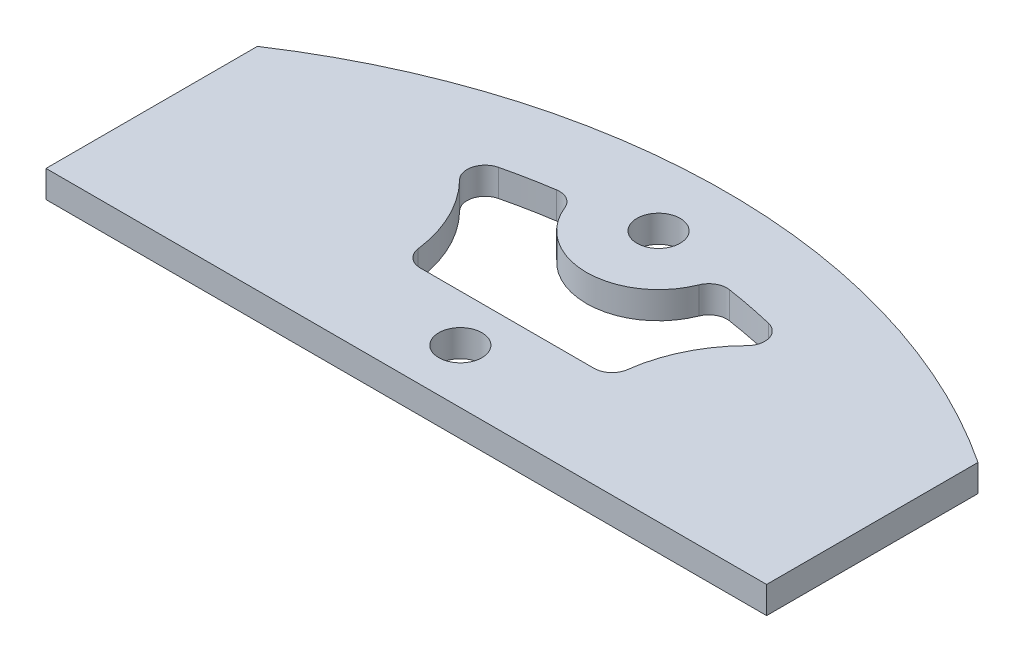
ISO-10303-21;
HEADER;
FILE_DESCRIPTION(('STEP AP214'),'2;1');
FILE_NAME('part.step','',(''),(''),'','','');
FILE_SCHEMA(('AUTOMOTIVE_DESIGN { 1 0 10303 214 1 1 1 1 }'));
ENDSEC;
DATA;
#1=APPLICATION_CONTEXT('core data for automotive mechanical design processes');
#2=APPLICATION_PROTOCOL_DEFINITION('international standard','automotive_design',2000,#1);
#3=PRODUCT_CONTEXT('',#1,'mechanical');
#4=PRODUCT('Part','Part','',(#3));
#5=PRODUCT_RELATED_PRODUCT_CATEGORY('part','',(#4));
#6=PRODUCT_DEFINITION_FORMATION('','',#4);
#7=PRODUCT_DEFINITION_CONTEXT('part definition',#1,'design');
#8=PRODUCT_DEFINITION('design','',#6,#7);
#9=PRODUCT_DEFINITION_SHAPE('','',#8);
#10=(LENGTH_UNIT() NAMED_UNIT(*) SI_UNIT(.MILLI.,.METRE.));
#11=(NAMED_UNIT(*) PLANE_ANGLE_UNIT() SI_UNIT($,.RADIAN.));
#12=(NAMED_UNIT(*) SI_UNIT($,.STERADIAN.) SOLID_ANGLE_UNIT());
#13=UNCERTAINTY_MEASURE_WITH_UNIT(LENGTH_MEASURE(1.E-05),#10,'distance_accuracy_value','');
#14=(GEOMETRIC_REPRESENTATION_CONTEXT(3) GLOBAL_UNCERTAINTY_ASSIGNED_CONTEXT((#13)) GLOBAL_UNIT_ASSIGNED_CONTEXT((#10,
#11,#12)) REPRESENTATION_CONTEXT('',''));
#15=CARTESIAN_POINT('',(0.,0.,0.));
#16=DIRECTION('',(0.,0.,1.));
#17=DIRECTION('',(1.,0.,0.));
#18=AXIS2_PLACEMENT_3D('',#15,#16,#17);
#19=CARTESIAN_POINT('',(17.0115720529893,3.,71.6490808823529));
#20=DIRECTION('',(0.,-1.,0.));
#21=DIRECTION('',(0.,0.,-1.));
#22=AXIS2_PLACEMENT_3D('',#19,#20,#21);
#23=PLANE('',#22);
#24=CARTESIAN_POINT('',(0.,3.,-43.));
#25=DIRECTION('',(0.,1.,0.));
#26=DIRECTION('',(0.,0.,1.));
#27=AXIS2_PLACEMENT_3D('',#24,#25,#26);
#28=CIRCLE('',#27,2.4);
#29=CARTESIAN_POINT('',(0.,3.,-40.6));
#30=VERTEX_POINT('',#29);
#31=EDGE_CURVE('E351',#30,#30,#28,.T.);
#32=ORIENTED_EDGE('',*,*,#31,.F.);
#33=EDGE_LOOP('',(#32));
#34=FACE_BOUND('',#33,.T.);
#35=CARTESIAN_POINT('',(0.,3.,-65.));
#36=DIRECTION('',(0.,1.,0.));
#37=DIRECTION('',(0.,0.,1.));
#38=AXIS2_PLACEMENT_3D('',#35,#36,#37);
#39=CIRCLE('',#38,2.4);
#40=CARTESIAN_POINT('',(0.,3.,-62.6));
#41=VERTEX_POINT('',#40);
#42=EDGE_CURVE('E353',#41,#41,#39,.T.);
#43=ORIENTED_EDGE('',*,*,#42,.F.);
#44=EDGE_LOOP('',(#43));
#45=FACE_BOUND('',#44,.T.);
#46=CARTESIAN_POINT('',(-14.5263223201297,3.,-60.2742561949271));
#47=DIRECTION('',(0.,1.,0.));
#48=DIRECTION('',(0.,0.,1.));
#49=AXIS2_PLACEMENT_3D('',#46,#47,#48);
#50=CIRCLE('',#49,2.);
#51=CARTESIAN_POINT('',(-15.9518854835434,3.,-58.871484058364));
#52=VERTEX_POINT('',#51);
#53=CARTESIAN_POINT('',(-14.9949133627145,3.,-62.2185870399247));
#54=VERTEX_POINT('',#53);
#55=EDGE_CURVE('E57',#52,#54,#50,.F.);
#56=ORIENTED_EDGE('',*,*,#55,.T.);
#57=CARTESIAN_POINT('',(0.,3.,0.));
#58=DIRECTION('',(0.,1.,0.));
#59=DIRECTION('',(0.,0.,1.));
#60=AXIS2_PLACEMENT_3D('',#57,#58,#59);
#61=CIRCLE('',#60,64.);
#62=CARTESIAN_POINT('',(-9.5900052029121,3.,-63.2774193548387));
#63=VERTEX_POINT('',#62);
#64=EDGE_CURVE('E179',#63,#54,#61,.T.);
#65=ORIENTED_EDGE('',*,*,#64,.F.);
#66=CARTESIAN_POINT('',(-9.2903175403211,3.,-61.3));
#67=DIRECTION('',(0.,1.,0.));
#68=DIRECTION('',(0.,0.,1.));
#69=AXIS2_PLACEMENT_3D('',#66,#67,#68);
#70=CIRCLE('',#69,2.);
#71=CARTESIAN_POINT('',(-7.43225403225686,3.,-62.04));
#72=VERTEX_POINT('',#71);
#73=EDGE_CURVE('E235',#63,#72,#70,.F.);
#74=ORIENTED_EDGE('',*,*,#73,.T.);
#75=CARTESIAN_POINT('',(0.,3.,-65.));
#76=DIRECTION('',(0.,1.,0.));
#77=DIRECTION('',(0.,0.,1.));
#78=AXIS2_PLACEMENT_3D('',#75,#76,#77);
#79=CIRCLE('',#78,7.99999999999991);
#80=CARTESIAN_POINT('',(7.43225403225689,3.,-62.04));
#81=VERTEX_POINT('',#80);
#82=EDGE_CURVE('E232',#72,#81,#79,.T.);
#83=ORIENTED_EDGE('',*,*,#82,.T.);
#84=CARTESIAN_POINT('',(9.29031754032113,3.,-61.3));
#85=DIRECTION('',(0.,1.,0.));
#86=DIRECTION('',(0.,0.,1.));
#87=AXIS2_PLACEMENT_3D('',#84,#85,#86);
#88=CIRCLE('',#87,2.);
#89=CARTESIAN_POINT('',(9.59000520291214,3.,-63.2774193548387));
#90=VERTEX_POINT('',#89);
#91=EDGE_CURVE('E229',#81,#90,#88,.F.);
#92=ORIENTED_EDGE('',*,*,#91,.T.);
#93=CARTESIAN_POINT('',(0.,3.,0.));
#94=DIRECTION('',(0.,1.,0.));
#95=DIRECTION('',(0.,0.,1.));
#96=AXIS2_PLACEMENT_3D('',#93,#94,#95);
#97=CIRCLE('',#96,64.);
#98=CARTESIAN_POINT('',(14.9949133627145,3.,-62.2185870399247));
#99=VERTEX_POINT('',#98);
#100=EDGE_CURVE('E226',#99,#90,#97,.T.);
#101=ORIENTED_EDGE('',*,*,#100,.F.);
#102=CARTESIAN_POINT('',(14.5263223201297,3.,-60.274256194927));
#103=DIRECTION('',(0.,1.,0.));
#104=DIRECTION('',(0.,0.,1.));
#105=AXIS2_PLACEMENT_3D('',#102,#103,#104);
#106=CIRCLE('',#105,2.);
#107=CARTESIAN_POINT('',(15.9518854835434,3.,-58.871484058364));
#108=VERTEX_POINT('',#107);
#109=EDGE_CURVE('E223',#99,#108,#106,.F.);
#110=ORIENTED_EDGE('',*,*,#109,.T.);
#111=CARTESIAN_POINT('',(27.,3.,-48.));
#112=DIRECTION('',(0.,1.,0.));
#113=DIRECTION('',(0.,0.,1.));
#114=AXIS2_PLACEMENT_3D('',#111,#112,#113);
#115=CIRCLE('',#114,15.5);
#116=CARTESIAN_POINT('',(11.6229694222924,3.,-49.9485714285714));
#117=VERTEX_POINT('',#116);
#118=EDGE_CURVE('E220',#108,#117,#115,.T.);
#119=ORIENTED_EDGE('',*,*,#118,.T.);
#120=CARTESIAN_POINT('',(9.63883644452367,3.,-50.2));
#121=DIRECTION('',(0.,1.,0.));
#122=DIRECTION('',(0.,0.,1.));
#123=AXIS2_PLACEMENT_3D('',#120,#121,#122);
#124=CIRCLE('',#123,2.);
#125=CARTESIAN_POINT('',(9.63883644452367,3.,-48.2));
#126=VERTEX_POINT('',#125);
#127=EDGE_CURVE('E217',#126,#117,#124,.T.);
#128=ORIENTED_EDGE('',*,*,#127,.F.);
#129=DIRECTION('',(1.,0.,0.));
#130=VECTOR('',#129,1.);
#131=CARTESIAN_POINT('',(0.,3.,-48.2));
#132=LINE('',#131,#130);
#133=CARTESIAN_POINT('',(-9.63883644452365,3.,-48.2));
#134=VERTEX_POINT('',#133);
#135=EDGE_CURVE('E214',#134,#126,#132,.T.);
#136=ORIENTED_EDGE('',*,*,#135,.F.);
#137=CARTESIAN_POINT('',(-9.63883644452365,3.,-50.2));
#138=DIRECTION('',(0.,1.,0.));
#139=DIRECTION('',(0.,0.,1.));
#140=AXIS2_PLACEMENT_3D('',#137,#138,#139);
#141=CIRCLE('',#140,2.);
#142=CARTESIAN_POINT('',(-11.6229694222924,3.,-49.9485714285714));
#143=VERTEX_POINT('',#142);
#144=EDGE_CURVE('E211',#134,#143,#141,.F.);
#145=ORIENTED_EDGE('',*,*,#144,.T.);
#146=CARTESIAN_POINT('',(-27.,3.,-48.));
#147=DIRECTION('',(0.,1.,0.));
#148=DIRECTION('',(0.,0.,1.));
#149=AXIS2_PLACEMENT_3D('',#146,#147,#148);
#150=CIRCLE('',#149,15.5);
#151=EDGE_CURVE('E208',#143,#52,#150,.T.);
#152=ORIENTED_EDGE('',*,*,#151,.T.);
#153=EDGE_LOOP('',(#56,#65,#74,#83,#92,#101,#110,#119,#128,#136,#145,#152));
#154=FACE_BOUND('',#153,.T.);
#155=DIRECTION('',(0.,0.,-1.));
#156=VECTOR('',#155,1.);
#157=CARTESIAN_POINT('',(40.,3.,-77.0000000000001));
#158=LINE('',#157,#156);
#159=CARTESIAN_POINT('',(40.,3.,-37.0000000000001));
#160=VERTEX_POINT('',#159);
#161=CARTESIAN_POINT('',(40.,3.,-60.4669331122391));
#162=VERTEX_POINT('',#161);
#163=EDGE_CURVE('E169',#160,#162,#158,.T.);
#164=ORIENTED_EDGE('',*,*,#163,.T.);
#165=CARTESIAN_POINT('',(0.,3.,0.));
#166=DIRECTION('',(0.,1.,0.));
#167=DIRECTION('',(0.,0.,1.));
#168=AXIS2_PLACEMENT_3D('',#165,#166,#167);
#169=CIRCLE('',#168,72.5);
#170=CARTESIAN_POINT('',(-40.,3.,-60.4669331122391));
#171=VERTEX_POINT('',#170);
#172=EDGE_CURVE('E264',#162,#171,#169,.T.);
#173=ORIENTED_EDGE('',*,*,#172,.T.);
#174=DIRECTION('',(0.,0.,1.));
#175=VECTOR('',#174,1.);
#176=CARTESIAN_POINT('',(-40.,3.,-77.0000000000001));
#177=LINE('',#176,#175);
#178=CARTESIAN_POINT('',(-40.,3.,-37.0000000000001));
#179=VERTEX_POINT('',#178);
#180=EDGE_CURVE('E49',#171,#179,#177,.T.);
#181=ORIENTED_EDGE('',*,*,#180,.T.);
#182=DIRECTION('',(1.,0.,0.));
#183=VECTOR('',#182,1.);
#184=CARTESIAN_POINT('',(-40.,3.,-37.0000000000001));
#185=LINE('',#184,#183);
#186=EDGE_CURVE('E162',#179,#160,#185,.T.);
#187=ORIENTED_EDGE('',*,*,#186,.T.);
#188=EDGE_LOOP('',(#164,#173,#181,#187));
#189=FACE_BOUND('',#188,.T.);
#190=ADVANCED_FACE('F34',(#34,#45,#154,#189),#23,.F.);
#191=CARTESIAN_POINT('',(17.0115720529893,0.,71.6490808823529));
#192=DIRECTION('',(0.,-1.,0.));
#193=DIRECTION('',(0.,0.,-1.));
#194=AXIS2_PLACEMENT_3D('',#191,#192,#193);
#195=PLANE('',#194);
#196=CARTESIAN_POINT('',(0.,0.,-43.));
#197=DIRECTION('',(0.,1.,0.));
#198=DIRECTION('',(0.,0.,1.));
#199=AXIS2_PLACEMENT_3D('',#196,#197,#198);
#200=CIRCLE('',#199,2.4);
#201=CARTESIAN_POINT('',(0.,0.,-40.6));
#202=VERTEX_POINT('',#201);
#203=EDGE_CURVE('E349',#202,#202,#200,.T.);
#204=ORIENTED_EDGE('',*,*,#203,.T.);
#205=EDGE_LOOP('',(#204));
#206=FACE_BOUND('',#205,.T.);
#207=CARTESIAN_POINT('',(0.,0.,-65.));
#208=DIRECTION('',(0.,1.,0.));
#209=DIRECTION('',(0.,0.,1.));
#210=AXIS2_PLACEMENT_3D('',#207,#208,#209);
#211=CIRCLE('',#210,2.4);
#212=CARTESIAN_POINT('',(0.,0.,-62.6));
#213=VERTEX_POINT('',#212);
#214=EDGE_CURVE('E172',#213,#213,#211,.T.);
#215=ORIENTED_EDGE('',*,*,#214,.T.);
#216=EDGE_LOOP('',(#215));
#217=FACE_BOUND('',#216,.T.);
#218=CARTESIAN_POINT('',(0.,0.,0.));
#219=DIRECTION('',(0.,1.,0.));
#220=DIRECTION('',(0.,0.,1.));
#221=AXIS2_PLACEMENT_3D('',#218,#219,#220);
#222=CIRCLE('',#221,64.);
#223=CARTESIAN_POINT('',(-9.5900052029121,0.,-63.2774193548387));
#224=VERTEX_POINT('',#223);
#225=CARTESIAN_POINT('',(-14.9949133627145,0.,-62.2185870399247));
#226=VERTEX_POINT('',#225);
#227=EDGE_CURVE('E203',#224,#226,#222,.T.);
#228=ORIENTED_EDGE('',*,*,#227,.T.);
#229=CARTESIAN_POINT('',(-14.5263223201297,0.,-60.2742561949271));
#230=DIRECTION('',(0.,1.,0.));
#231=DIRECTION('',(0.,0.,1.));
#232=AXIS2_PLACEMENT_3D('',#229,#230,#231);
#233=CIRCLE('',#232,2.);
#234=CARTESIAN_POINT('',(-15.9518854835434,0.,-58.871484058364));
#235=VERTEX_POINT('',#234);
#236=EDGE_CURVE('E176',#235,#226,#233,.F.);
#237=ORIENTED_EDGE('',*,*,#236,.F.);
#238=CARTESIAN_POINT('',(-27.,0.,-48.));
#239=DIRECTION('',(0.,1.,0.));
#240=DIRECTION('',(0.,0.,1.));
#241=AXIS2_PLACEMENT_3D('',#238,#239,#240);
#242=CIRCLE('',#241,15.5);
#243=CARTESIAN_POINT('',(-11.6229694222924,0.,-49.9485714285714));
#244=VERTEX_POINT('',#243);
#245=EDGE_CURVE('E178',#244,#235,#242,.T.);
#246=ORIENTED_EDGE('',*,*,#245,.F.);
#247=CARTESIAN_POINT('',(-9.63883644452365,0.,-50.2));
#248=DIRECTION('',(0.,1.,0.));
#249=DIRECTION('',(0.,0.,1.));
#250=AXIS2_PLACEMENT_3D('',#247,#248,#249);
#251=CIRCLE('',#250,2.);
#252=CARTESIAN_POINT('',(-9.63883644452365,0.,-48.2));
#253=VERTEX_POINT('',#252);
#254=EDGE_CURVE('E181',#253,#244,#251,.F.);
#255=ORIENTED_EDGE('',*,*,#254,.F.);
#256=DIRECTION('',(1.,0.,0.));
#257=VECTOR('',#256,1.);
#258=CARTESIAN_POINT('',(0.,0.,-48.2));
#259=LINE('',#258,#257);
#260=CARTESIAN_POINT('',(9.63883644452367,0.,-48.2));
#261=VERTEX_POINT('',#260);
#262=EDGE_CURVE('E184',#253,#261,#259,.T.);
#263=ORIENTED_EDGE('',*,*,#262,.T.);
#264=CARTESIAN_POINT('',(9.63883644452367,0.,-50.2));
#265=DIRECTION('',(0.,1.,0.));
#266=DIRECTION('',(0.,0.,1.));
#267=AXIS2_PLACEMENT_3D('',#264,#265,#266);
#268=CIRCLE('',#267,2.);
#269=CARTESIAN_POINT('',(11.6229694222924,0.,-49.9485714285714));
#270=VERTEX_POINT('',#269);
#271=EDGE_CURVE('E187',#261,#270,#268,.T.);
#272=ORIENTED_EDGE('',*,*,#271,.T.);
#273=CARTESIAN_POINT('',(27.,0.,-48.));
#274=DIRECTION('',(0.,1.,0.));
#275=DIRECTION('',(0.,0.,1.));
#276=AXIS2_PLACEMENT_3D('',#273,#274,#275);
#277=CIRCLE('',#276,15.5);
#278=CARTESIAN_POINT('',(15.9518854835434,0.,-58.871484058364));
#279=VERTEX_POINT('',#278);
#280=EDGE_CURVE('E190',#279,#270,#277,.T.);
#281=ORIENTED_EDGE('',*,*,#280,.F.);
#282=CARTESIAN_POINT('',(14.5263223201297,0.,-60.274256194927));
#283=DIRECTION('',(0.,1.,0.));
#284=DIRECTION('',(0.,0.,1.));
#285=AXIS2_PLACEMENT_3D('',#282,#283,#284);
#286=CIRCLE('',#285,2.);
#287=CARTESIAN_POINT('',(14.9949133627145,0.,-62.2185870399247));
#288=VERTEX_POINT('',#287);
#289=EDGE_CURVE('E192',#288,#279,#286,.F.);
#290=ORIENTED_EDGE('',*,*,#289,.F.);
#291=CARTESIAN_POINT('',(0.,0.,0.));
#292=DIRECTION('',(0.,1.,0.));
#293=DIRECTION('',(0.,0.,1.));
#294=AXIS2_PLACEMENT_3D('',#291,#292,#293);
#295=CIRCLE('',#294,64.);
#296=CARTESIAN_POINT('',(9.59000520291214,0.,-63.2774193548387));
#297=VERTEX_POINT('',#296);
#298=EDGE_CURVE('E194',#288,#297,#295,.T.);
#299=ORIENTED_EDGE('',*,*,#298,.T.);
#300=CARTESIAN_POINT('',(9.29031754032113,0.,-61.3));
#301=DIRECTION('',(0.,1.,0.));
#302=DIRECTION('',(0.,0.,1.));
#303=AXIS2_PLACEMENT_3D('',#300,#301,#302);
#304=CIRCLE('',#303,2.);
#305=CARTESIAN_POINT('',(7.43225403225689,0.,-62.04));
#306=VERTEX_POINT('',#305);
#307=EDGE_CURVE('E197',#306,#297,#304,.F.);
#308=ORIENTED_EDGE('',*,*,#307,.F.);
#309=CARTESIAN_POINT('',(0.,0.,-65.));
#310=DIRECTION('',(0.,1.,0.));
#311=DIRECTION('',(0.,0.,1.));
#312=AXIS2_PLACEMENT_3D('',#309,#310,#311);
#313=CIRCLE('',#312,7.99999999999991);
#314=CARTESIAN_POINT('',(-7.43225403225686,0.,-62.04));
#315=VERTEX_POINT('',#314);
#316=EDGE_CURVE('E199',#315,#306,#313,.T.);
#317=ORIENTED_EDGE('',*,*,#316,.F.);
#318=CARTESIAN_POINT('',(-9.2903175403211,0.,-61.3));
#319=DIRECTION('',(0.,1.,0.));
#320=DIRECTION('',(0.,0.,1.));
#321=AXIS2_PLACEMENT_3D('',#318,#319,#320);
#322=CIRCLE('',#321,2.);
#323=EDGE_CURVE('E201',#224,#315,#322,.F.);
#324=ORIENTED_EDGE('',*,*,#323,.F.);
#325=EDGE_LOOP('',(#228,#237,#246,#255,#263,#272,#281,#290,#299,#308,#317,#324));
#326=FACE_BOUND('',#325,.T.);
#327=CARTESIAN_POINT('',(0.,0.,0.));
#328=DIRECTION('',(0.,1.,0.));
#329=DIRECTION('',(0.,0.,1.));
#330=AXIS2_PLACEMENT_3D('',#327,#328,#329);
#331=CIRCLE('',#330,72.5);
#332=CARTESIAN_POINT('',(40.,0.,-60.4669331122391));
#333=VERTEX_POINT('',#332);
#334=CARTESIAN_POINT('',(-40.,0.,-60.4669331122391));
#335=VERTEX_POINT('',#334);
#336=EDGE_CURVE('E242',#333,#335,#331,.T.);
#337=ORIENTED_EDGE('',*,*,#336,.F.);
#338=DIRECTION('',(0.,0.,-1.));
#339=VECTOR('',#338,1.);
#340=CARTESIAN_POINT('',(40.,0.,-77.0000000000001));
#341=LINE('',#340,#339);
#342=CARTESIAN_POINT('',(40.,0.,-37.0000000000001));
#343=VERTEX_POINT('',#342);
#344=EDGE_CURVE('E155',#343,#333,#341,.T.);
#345=ORIENTED_EDGE('',*,*,#344,.F.);
#346=DIRECTION('',(1.,0.,0.));
#347=VECTOR('',#346,1.);
#348=CARTESIAN_POINT('',(-40.,0.,-37.0000000000001));
#349=LINE('',#348,#347);
#350=CARTESIAN_POINT('',(-40.,0.,-37.0000000000001));
#351=VERTEX_POINT('',#350);
#352=EDGE_CURVE('E154',#351,#343,#349,.T.);
#353=ORIENTED_EDGE('',*,*,#352,.F.);
#354=DIRECTION('',(0.,0.,1.));
#355=VECTOR('',#354,1.);
#356=CARTESIAN_POINT('',(-40.,0.,-77.0000000000001));
#357=LINE('',#356,#355);
#358=EDGE_CURVE('E145',#335,#351,#357,.T.);
#359=ORIENTED_EDGE('',*,*,#358,.F.);
#360=EDGE_LOOP('',(#337,#345,#353,#359));
#361=FACE_BOUND('',#360,.T.);
#362=ADVANCED_FACE('F165',(#206,#217,#326,#361),#195,.T.);
#363=CARTESIAN_POINT('',(0.,3.,0.));
#364=DIRECTION('',(0.,-1.,0.));
#365=DIRECTION('',(0.,0.,-1.));
#366=AXIS2_PLACEMENT_3D('',#363,#364,#365);
#367=CYLINDRICAL_SURFACE('',#366,72.5);
#368=DIRECTION('',(0.,-1.,0.));
#369=VECTOR('',#368,1.);
#370=CARTESIAN_POINT('',(40.,3.,-60.4669331122391));
#371=LINE('',#370,#369);
#372=EDGE_CURVE('E12',#333,#162,#371,.F.);
#373=ORIENTED_EDGE('',*,*,#372,.F.);
#374=ORIENTED_EDGE('',*,*,#336,.T.);
#375=DIRECTION('',(0.,-1.,0.));
#376=VECTOR('',#375,1.);
#377=CARTESIAN_POINT('',(-40.,3.,-60.4669331122391));
#378=LINE('',#377,#376);
#379=EDGE_CURVE('E42',#171,#335,#378,.T.);
#380=ORIENTED_EDGE('',*,*,#379,.F.);
#381=ORIENTED_EDGE('',*,*,#172,.F.);
#382=EDGE_LOOP('',(#373,#374,#380,#381));
#383=FACE_BOUND('',#382,.T.);
#384=ADVANCED_FACE('F36',(#383),#367,.T.);
#385=CARTESIAN_POINT('',(-14.5263223201297,0.,-60.2742561949271));
#386=DIRECTION('',(0.,1.,0.));
#387=DIRECTION('',(0.,0.,1.));
#388=AXIS2_PLACEMENT_3D('',#385,#386,#387);
#389=CYLINDRICAL_SURFACE('',#388,2.);
#390=ORIENTED_EDGE('',*,*,#55,.F.);
#391=DIRECTION('',(0.,1.,0.));
#392=VECTOR('',#391,1.);
#393=CARTESIAN_POINT('',(-15.9518854835434,0.,-58.871484058364));
#394=LINE('',#393,#392);
#395=EDGE_CURVE('E206',#235,#52,#394,.T.);
#396=ORIENTED_EDGE('',*,*,#395,.F.);
#397=ORIENTED_EDGE('',*,*,#236,.T.);
#398=DIRECTION('',(0.,1.,0.));
#399=VECTOR('',#398,1.);
#400=CARTESIAN_POINT('',(-14.9949133627145,0.,-62.2185870399247));
#401=LINE('',#400,#399);
#402=EDGE_CURVE('E240',#226,#54,#401,.T.);
#403=ORIENTED_EDGE('',*,*,#402,.T.);
#404=EDGE_LOOP('',(#390,#396,#397,#403));
#405=FACE_BOUND('',#404,.T.);
#406=ADVANCED_FACE('F284',(#405),#389,.F.);
#407=CARTESIAN_POINT('',(0.,0.,0.));
#408=DIRECTION('',(0.,1.,0.));
#409=DIRECTION('',(0.,0.,1.));
#410=AXIS2_PLACEMENT_3D('',#407,#408,#409);
#411=CYLINDRICAL_SURFACE('',#410,64.);
#412=ORIENTED_EDGE('',*,*,#64,.T.);
#413=ORIENTED_EDGE('',*,*,#402,.F.);
#414=ORIENTED_EDGE('',*,*,#227,.F.);
#415=DIRECTION('',(0.,1.,0.));
#416=VECTOR('',#415,1.);
#417=CARTESIAN_POINT('',(-9.5900052029121,0.,-63.2774193548387));
#418=LINE('',#417,#416);
#419=EDGE_CURVE('E243',#224,#63,#418,.T.);
#420=ORIENTED_EDGE('',*,*,#419,.T.);
#421=EDGE_LOOP('',(#412,#413,#414,#420));
#422=FACE_BOUND('',#421,.T.);
#423=ADVANCED_FACE('F287',(#422),#411,.F.);
#424=CARTESIAN_POINT('',(-9.2903175403211,0.,-61.3));
#425=DIRECTION('',(0.,1.,0.));
#426=DIRECTION('',(0.,0.,1.));
#427=AXIS2_PLACEMENT_3D('',#424,#425,#426);
#428=CYLINDRICAL_SURFACE('',#427,2.);
#429=ORIENTED_EDGE('',*,*,#73,.F.);
#430=ORIENTED_EDGE('',*,*,#419,.F.);
#431=ORIENTED_EDGE('',*,*,#323,.T.);
#432=DIRECTION('',(0.,1.,0.));
#433=VECTOR('',#432,1.);
#434=CARTESIAN_POINT('',(-7.43225403225686,0.,-62.04));
#435=LINE('',#434,#433);
#436=EDGE_CURVE('E245',#315,#72,#435,.T.);
#437=ORIENTED_EDGE('',*,*,#436,.T.);
#438=EDGE_LOOP('',(#429,#430,#431,#437));
#439=FACE_BOUND('',#438,.T.);
#440=ADVANCED_FACE('F323',(#439),#428,.F.);
#441=CARTESIAN_POINT('',(0.,0.,-65.));
#442=DIRECTION('',(0.,1.,0.));
#443=DIRECTION('',(0.,0.,1.));
#444=AXIS2_PLACEMENT_3D('',#441,#442,#443);
#445=CYLINDRICAL_SURFACE('',#444,7.99999999999991);
#446=ORIENTED_EDGE('',*,*,#82,.F.);
#447=ORIENTED_EDGE('',*,*,#436,.F.);
#448=ORIENTED_EDGE('',*,*,#316,.T.);
#449=DIRECTION('',(0.,1.,0.));
#450=VECTOR('',#449,1.);
#451=CARTESIAN_POINT('',(7.43225403225689,0.,-62.04));
#452=LINE('',#451,#450);
#453=EDGE_CURVE('E247',#306,#81,#452,.T.);
#454=ORIENTED_EDGE('',*,*,#453,.T.);
#455=EDGE_LOOP('',(#446,#447,#448,#454));
#456=FACE_BOUND('',#455,.T.);
#457=ADVANCED_FACE('F319',(#456),#445,.T.);
#458=CARTESIAN_POINT('',(9.29031754032113,0.,-61.3));
#459=DIRECTION('',(0.,1.,0.));
#460=DIRECTION('',(0.,0.,1.));
#461=AXIS2_PLACEMENT_3D('',#458,#459,#460);
#462=CYLINDRICAL_SURFACE('',#461,2.);
#463=ORIENTED_EDGE('',*,*,#91,.F.);
#464=ORIENTED_EDGE('',*,*,#453,.F.);
#465=ORIENTED_EDGE('',*,*,#307,.T.);
#466=DIRECTION('',(0.,1.,0.));
#467=VECTOR('',#466,1.);
#468=CARTESIAN_POINT('',(9.59000520291214,0.,-63.2774193548387));
#469=LINE('',#468,#467);
#470=EDGE_CURVE('E249',#297,#90,#469,.T.);
#471=ORIENTED_EDGE('',*,*,#470,.T.);
#472=EDGE_LOOP('',(#463,#464,#465,#471));
#473=FACE_BOUND('',#472,.T.);
#474=ADVANCED_FACE('F315',(#473),#462,.F.);
#475=CARTESIAN_POINT('',(0.,0.,0.));
#476=DIRECTION('',(0.,1.,0.));
#477=DIRECTION('',(0.,0.,1.));
#478=AXIS2_PLACEMENT_3D('',#475,#476,#477);
#479=CYLINDRICAL_SURFACE('',#478,64.);
#480=ORIENTED_EDGE('',*,*,#100,.T.);
#481=ORIENTED_EDGE('',*,*,#470,.F.);
#482=ORIENTED_EDGE('',*,*,#298,.F.);
#483=DIRECTION('',(0.,1.,0.));
#484=VECTOR('',#483,1.);
#485=CARTESIAN_POINT('',(14.9949133627145,0.,-62.2185870399247));
#486=LINE('',#485,#484);
#487=EDGE_CURVE('E251',#288,#99,#486,.T.);
#488=ORIENTED_EDGE('',*,*,#487,.T.);
#489=EDGE_LOOP('',(#480,#481,#482,#488));
#490=FACE_BOUND('',#489,.T.);
#491=ADVANCED_FACE('F311',(#490),#479,.F.);
#492=CARTESIAN_POINT('',(14.5263223201297,0.,-60.274256194927));
#493=DIRECTION('',(0.,1.,0.));
#494=DIRECTION('',(0.,0.,1.));
#495=AXIS2_PLACEMENT_3D('',#492,#493,#494);
#496=CYLINDRICAL_SURFACE('',#495,2.);
#497=ORIENTED_EDGE('',*,*,#109,.F.);
#498=ORIENTED_EDGE('',*,*,#487,.F.);
#499=ORIENTED_EDGE('',*,*,#289,.T.);
#500=DIRECTION('',(0.,1.,0.));
#501=VECTOR('',#500,1.);
#502=CARTESIAN_POINT('',(15.9518854835434,0.,-58.871484058364));
#503=LINE('',#502,#501);
#504=EDGE_CURVE('E253',#279,#108,#503,.T.);
#505=ORIENTED_EDGE('',*,*,#504,.T.);
#506=EDGE_LOOP('',(#497,#498,#499,#505));
#507=FACE_BOUND('',#506,.T.);
#508=ADVANCED_FACE('F307',(#507),#496,.F.);
#509=CARTESIAN_POINT('',(27.,0.,-48.));
#510=DIRECTION('',(0.,1.,0.));
#511=DIRECTION('',(0.,0.,1.));
#512=AXIS2_PLACEMENT_3D('',#509,#510,#511);
#513=CYLINDRICAL_SURFACE('',#512,15.5);
#514=ORIENTED_EDGE('',*,*,#118,.F.);
#515=ORIENTED_EDGE('',*,*,#504,.F.);
#516=ORIENTED_EDGE('',*,*,#280,.T.);
#517=DIRECTION('',(0.,1.,0.));
#518=VECTOR('',#517,1.);
#519=CARTESIAN_POINT('',(11.6229694222924,0.,-49.9485714285714));
#520=LINE('',#519,#518);
#521=EDGE_CURVE('E255',#270,#117,#520,.T.);
#522=ORIENTED_EDGE('',*,*,#521,.T.);
#523=EDGE_LOOP('',(#514,#515,#516,#522));
#524=FACE_BOUND('',#523,.T.);
#525=ADVANCED_FACE('F303',(#524),#513,.T.);
#526=CARTESIAN_POINT('',(9.63883644452367,0.,-50.2));
#527=DIRECTION('',(0.,1.,0.));
#528=DIRECTION('',(0.,0.,1.));
#529=AXIS2_PLACEMENT_3D('',#526,#527,#528);
#530=CYLINDRICAL_SURFACE('',#529,2.);
#531=ORIENTED_EDGE('',*,*,#127,.T.);
#532=ORIENTED_EDGE('',*,*,#521,.F.);
#533=ORIENTED_EDGE('',*,*,#271,.F.);
#534=DIRECTION('',(0.,1.,0.));
#535=VECTOR('',#534,1.);
#536=CARTESIAN_POINT('',(9.63883644452367,0.,-48.2));
#537=LINE('',#536,#535);
#538=EDGE_CURVE('E257',#261,#126,#537,.T.);
#539=ORIENTED_EDGE('',*,*,#538,.T.);
#540=EDGE_LOOP('',(#531,#532,#533,#539));
#541=FACE_BOUND('',#540,.T.);
#542=ADVANCED_FACE('F299',(#541),#530,.F.);
#543=CARTESIAN_POINT('',(0.,0.,-48.2));
#544=DIRECTION('',(0.,0.,1.));
#545=DIRECTION('',(1.,0.,0.));
#546=AXIS2_PLACEMENT_3D('',#543,#544,#545);
#547=PLANE('',#546);
#548=ORIENTED_EDGE('',*,*,#135,.T.);
#549=ORIENTED_EDGE('',*,*,#538,.F.);
#550=ORIENTED_EDGE('',*,*,#262,.F.);
#551=DIRECTION('',(0.,1.,0.));
#552=VECTOR('',#551,1.);
#553=CARTESIAN_POINT('',(-9.63883644452365,0.,-48.2));
#554=LINE('',#553,#552);
#555=EDGE_CURVE('E259',#253,#134,#554,.T.);
#556=ORIENTED_EDGE('',*,*,#555,.T.);
#557=EDGE_LOOP('',(#548,#549,#550,#556));
#558=FACE_BOUND('',#557,.T.);
#559=ADVANCED_FACE('F295',(#558),#547,.F.);
#560=CARTESIAN_POINT('',(-9.63883644452365,0.,-50.2));
#561=DIRECTION('',(0.,1.,0.));
#562=DIRECTION('',(0.,0.,1.));
#563=AXIS2_PLACEMENT_3D('',#560,#561,#562);
#564=CYLINDRICAL_SURFACE('',#563,2.);
#565=ORIENTED_EDGE('',*,*,#144,.F.);
#566=ORIENTED_EDGE('',*,*,#555,.F.);
#567=ORIENTED_EDGE('',*,*,#254,.T.);
#568=DIRECTION('',(0.,1.,0.));
#569=VECTOR('',#568,1.);
#570=CARTESIAN_POINT('',(-11.6229694222924,0.,-49.9485714285714));
#571=LINE('',#570,#569);
#572=EDGE_CURVE('E261',#244,#143,#571,.T.);
#573=ORIENTED_EDGE('',*,*,#572,.T.);
#574=EDGE_LOOP('',(#565,#566,#567,#573));
#575=FACE_BOUND('',#574,.T.);
#576=ADVANCED_FACE('F291',(#575),#564,.F.);
#577=CARTESIAN_POINT('',(-27.,0.,-48.));
#578=DIRECTION('',(0.,1.,0.));
#579=DIRECTION('',(0.,0.,1.));
#580=AXIS2_PLACEMENT_3D('',#577,#578,#579);
#581=CYLINDRICAL_SURFACE('',#580,15.5);
#582=ORIENTED_EDGE('',*,*,#151,.F.);
#583=ORIENTED_EDGE('',*,*,#572,.F.);
#584=ORIENTED_EDGE('',*,*,#245,.T.);
#585=ORIENTED_EDGE('',*,*,#395,.T.);
#586=EDGE_LOOP('',(#582,#583,#584,#585));
#587=FACE_BOUND('',#586,.T.);
#588=ADVANCED_FACE('F288',(#587),#581,.T.);
#589=CARTESIAN_POINT('',(40.,0.,-77.0000000000001));
#590=DIRECTION('',(1.,0.,0.));
#591=DIRECTION('',(0.,0.,-1.));
#592=AXIS2_PLACEMENT_3D('',#589,#590,#591);
#593=PLANE('',#592);
#594=ORIENTED_EDGE('',*,*,#372,.T.);
#595=ORIENTED_EDGE('',*,*,#163,.F.);
#596=DIRECTION('',(0.,1.,0.));
#597=VECTOR('',#596,1.);
#598=CARTESIAN_POINT('',(40.,0.,-37.0000000000001));
#599=LINE('',#598,#597);
#600=EDGE_CURVE('E163',#343,#160,#599,.T.);
#601=ORIENTED_EDGE('',*,*,#600,.F.);
#602=ORIENTED_EDGE('',*,*,#344,.T.);
#603=EDGE_LOOP('',(#594,#595,#601,#602));
#604=FACE_BOUND('',#603,.T.);
#605=ADVANCED_FACE('F272',(#604),#593,.T.);
#606=CARTESIAN_POINT('',(-40.,0.,-77.0000000000001));
#607=DIRECTION('',(-1.,0.,0.));
#608=DIRECTION('',(0.,0.,1.));
#609=AXIS2_PLACEMENT_3D('',#606,#607,#608);
#610=PLANE('',#609);
#611=ORIENTED_EDGE('',*,*,#379,.T.);
#612=ORIENTED_EDGE('',*,*,#358,.T.);
#613=DIRECTION('',(0.,1.,0.));
#614=VECTOR('',#613,1.);
#615=CARTESIAN_POINT('',(-40.,0.,-37.0000000000001));
#616=LINE('',#615,#614);
#617=EDGE_CURVE('E148',#351,#179,#616,.T.);
#618=ORIENTED_EDGE('',*,*,#617,.T.);
#619=ORIENTED_EDGE('',*,*,#180,.F.);
#620=EDGE_LOOP('',(#611,#612,#618,#619));
#621=FACE_BOUND('',#620,.T.);
#622=ADVANCED_FACE('F147',(#621),#610,.T.);
#623=CARTESIAN_POINT('',(-40.,0.,-37.0000000000001));
#624=DIRECTION('',(0.,0.,1.));
#625=DIRECTION('',(1.,0.,0.));
#626=AXIS2_PLACEMENT_3D('',#623,#624,#625);
#627=PLANE('',#626);
#628=ORIENTED_EDGE('',*,*,#186,.F.);
#629=ORIENTED_EDGE('',*,*,#617,.F.);
#630=ORIENTED_EDGE('',*,*,#352,.T.);
#631=ORIENTED_EDGE('',*,*,#600,.T.);
#632=EDGE_LOOP('',(#628,#629,#630,#631));
#633=FACE_BOUND('',#632,.T.);
#634=ADVANCED_FACE('F159',(#633),#627,.T.);
#635=CARTESIAN_POINT('',(0.,0.,-65.));
#636=DIRECTION('',(0.,1.,0.));
#637=DIRECTION('',(0.,0.,1.));
#638=AXIS2_PLACEMENT_3D('',#635,#636,#637);
#639=CYLINDRICAL_SURFACE('',#638,2.4);
#640=ORIENTED_EDGE('',*,*,#214,.F.);
#641=EDGE_LOOP('',(#640));
#642=FACE_BOUND('',#641,.T.);
#643=ORIENTED_EDGE('',*,*,#42,.T.);
#644=EDGE_LOOP('',(#643));
#645=FACE_BOUND('',#644,.T.);
#646=ADVANCED_FACE('F337',(#642,#645),#639,.F.);
#647=CARTESIAN_POINT('',(0.,0.,-43.));
#648=DIRECTION('',(0.,1.,0.));
#649=DIRECTION('',(0.,0.,1.));
#650=AXIS2_PLACEMENT_3D('',#647,#648,#649);
#651=CYLINDRICAL_SURFACE('',#650,2.4);
#652=ORIENTED_EDGE('',*,*,#203,.F.);
#653=EDGE_LOOP('',(#652));
#654=FACE_BOUND('',#653,.T.);
#655=ORIENTED_EDGE('',*,*,#31,.T.);
#656=EDGE_LOOP('',(#655));
#657=FACE_BOUND('',#656,.T.);
#658=ADVANCED_FACE('F340',(#654,#657),#651,.F.);
#659=CLOSED_SHELL('',(#190,#362,#384,#406,#423,#440,#457,#474,#491,#508,#525,#542,#559,#576,
#588,#605,#622,#634,#646,#658));
#660=MANIFOLD_SOLID_BREP('B2',#659);
#661=ADVANCED_BREP_SHAPE_REPRESENTATION('',(#18,#660),#14);
#662=SHAPE_DEFINITION_REPRESENTATION(#9,#661);
ENDSEC;
END-ISO-10303-21;
